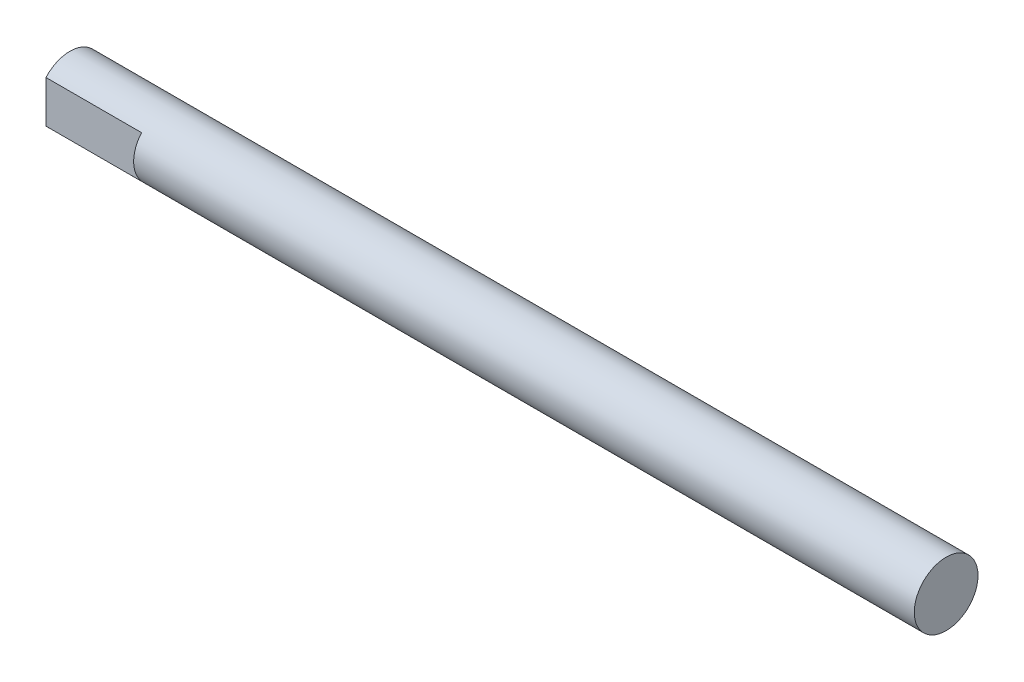
ISO-10303-21;
HEADER;
FILE_DESCRIPTION(('STEP AP214'),'2;1');
FILE_NAME('part.step','',(''),(''),'','','');
FILE_SCHEMA(('AUTOMOTIVE_DESIGN { 1 0 10303 214 1 1 1 1 }'));
ENDSEC;
DATA;
#1=APPLICATION_CONTEXT('core data for automotive mechanical design processes');
#2=APPLICATION_PROTOCOL_DEFINITION('international standard','automotive_design',2000,#1);
#3=PRODUCT_CONTEXT('',#1,'mechanical');
#4=PRODUCT('Part','Part','',(#3));
#5=PRODUCT_RELATED_PRODUCT_CATEGORY('part','',(#4));
#6=PRODUCT_DEFINITION_FORMATION('','',#4);
#7=PRODUCT_DEFINITION_CONTEXT('part definition',#1,'design');
#8=PRODUCT_DEFINITION('design','',#6,#7);
#9=PRODUCT_DEFINITION_SHAPE('','',#8);
#10=(LENGTH_UNIT() NAMED_UNIT(*) SI_UNIT(.MILLI.,.METRE.));
#11=(NAMED_UNIT(*) PLANE_ANGLE_UNIT() SI_UNIT($,.RADIAN.));
#12=(NAMED_UNIT(*) SI_UNIT($,.STERADIAN.) SOLID_ANGLE_UNIT());
#13=UNCERTAINTY_MEASURE_WITH_UNIT(LENGTH_MEASURE(1.E-05),#10,'distance_accuracy_value','');
#14=(GEOMETRIC_REPRESENTATION_CONTEXT(3) GLOBAL_UNCERTAINTY_ASSIGNED_CONTEXT((#13)) GLOBAL_UNIT_ASSIGNED_CONTEXT((#10,
#11,#12)) REPRESENTATION_CONTEXT('',''));
#15=CARTESIAN_POINT('',(0.,0.,0.));
#16=DIRECTION('',(0.,0.,1.));
#17=DIRECTION('',(1.,0.,0.));
#18=AXIS2_PLACEMENT_3D('',#15,#16,#17);
#19=CARTESIAN_POINT('',(0.,0.,0.));
#20=DIRECTION('',(1.,0.,0.));
#21=DIRECTION('',(0.,0.,-1.));
#22=AXIS2_PLACEMENT_3D('',#19,#20,#21);
#23=PLANE('',#22);
#24=DIRECTION('',(0.,-1.,0.));
#25=VECTOR('',#24,1.);
#26=CARTESIAN_POINT('',(0.,1.3228756555323,1.5));
#27=LINE('',#26,#25);
#28=CARTESIAN_POINT('',(0.,1.3228756555323,1.5));
#29=VERTEX_POINT('',#28);
#30=CARTESIAN_POINT('',(0.,-1.3228756555323,1.5));
#31=VERTEX_POINT('',#30);
#32=EDGE_CURVE('E75',#29,#31,#27,.T.);
#33=ORIENTED_EDGE('',*,*,#32,.F.);
#34=CARTESIAN_POINT('',(0.,0.,0.));
#35=DIRECTION('',(1.,0.,0.));
#36=DIRECTION('',(0.,0.,-1.));
#37=AXIS2_PLACEMENT_3D('',#34,#35,#36);
#38=CIRCLE('',#37,2.);
#39=EDGE_CURVE('E50',#31,#29,#38,.T.);
#40=ORIENTED_EDGE('',*,*,#39,.F.);
#41=EDGE_LOOP('',(#33,#40));
#42=FACE_BOUND('',#41,.T.);
#43=ADVANCED_FACE('F43',(#42),#23,.F.);
#44=CARTESIAN_POINT('',(55.,0.,0.));
#45=DIRECTION('',(-1.,0.,0.));
#46=DIRECTION('',(0.,0.,1.));
#47=AXIS2_PLACEMENT_3D('',#44,#45,#46);
#48=CYLINDRICAL_SURFACE('',#47,2.);
#49=CARTESIAN_POINT('',(6.,0.,0.));
#50=DIRECTION('',(-1.,0.,0.));
#51=DIRECTION('',(0.,0.,1.));
#52=AXIS2_PLACEMENT_3D('',#49,#50,#51);
#53=CIRCLE('',#52,2.);
#54=CARTESIAN_POINT('',(6.,-1.3228756555323,1.5));
#55=VERTEX_POINT('',#54);
#56=CARTESIAN_POINT('',(6.,1.3228756555323,1.5));
#57=VERTEX_POINT('',#56);
#58=EDGE_CURVE('E61',#55,#57,#53,.T.);
#59=ORIENTED_EDGE('',*,*,#58,.F.);
#60=DIRECTION('',(-1.,0.,0.));
#61=VECTOR('',#60,1.);
#62=CARTESIAN_POINT('',(6.,-1.3228756555323,1.5));
#63=LINE('',#62,#61);
#64=EDGE_CURVE('E79',#55,#31,#63,.T.);
#65=ORIENTED_EDGE('',*,*,#64,.T.);
#66=ORIENTED_EDGE('',*,*,#39,.T.);
#67=DIRECTION('',(-1.,0.,0.));
#68=VECTOR('',#67,1.);
#69=CARTESIAN_POINT('',(6.,1.3228756555323,1.5));
#70=LINE('',#69,#68);
#71=EDGE_CURVE('E68',#57,#29,#70,.T.);
#72=ORIENTED_EDGE('',*,*,#71,.F.);
#73=EDGE_LOOP('',(#59,#65,#66,#72));
#74=FACE_BOUND('',#73,.T.);
#75=CARTESIAN_POINT('',(55.,0.,0.));
#76=DIRECTION('',(1.,0.,0.));
#77=DIRECTION('',(0.,0.,-1.));
#78=AXIS2_PLACEMENT_3D('',#75,#76,#77);
#79=CIRCLE('',#78,2.);
#80=CARTESIAN_POINT('',(55.,0.,-2.));
#81=VERTEX_POINT('',#80);
#82=EDGE_CURVE('E11',#81,#81,#79,.T.);
#83=ORIENTED_EDGE('',*,*,#82,.F.);
#84=EDGE_LOOP('',(#83));
#85=FACE_BOUND('',#84,.T.);
#86=ADVANCED_FACE('F44',(#74,#85),#48,.T.);
#87=CARTESIAN_POINT('',(55.,0.,0.));
#88=DIRECTION('',(1.,0.,0.));
#89=DIRECTION('',(0.,0.,-1.));
#90=AXIS2_PLACEMENT_3D('',#87,#88,#89);
#91=PLANE('',#90);
#92=ORIENTED_EDGE('',*,*,#82,.T.);
#93=EDGE_LOOP('',(#92));
#94=FACE_BOUND('',#93,.T.);
#95=ADVANCED_FACE('F88',(#94),#91,.T.);
#96=CARTESIAN_POINT('',(6.,1.3228756555323,1.5));
#97=DIRECTION('',(0.,0.,-1.));
#98=DIRECTION('',(-1.,0.,0.));
#99=AXIS2_PLACEMENT_3D('',#96,#97,#98);
#100=PLANE('',#99);
#101=ORIENTED_EDGE('',*,*,#32,.T.);
#102=ORIENTED_EDGE('',*,*,#64,.F.);
#103=DIRECTION('',(0.,-1.,0.));
#104=VECTOR('',#103,1.);
#105=CARTESIAN_POINT('',(6.,1.3228756555323,1.5));
#106=LINE('',#105,#104);
#107=EDGE_CURVE('E60',#57,#55,#106,.T.);
#108=ORIENTED_EDGE('',*,*,#107,.F.);
#109=ORIENTED_EDGE('',*,*,#71,.T.);
#110=EDGE_LOOP('',(#101,#102,#108,#109));
#111=FACE_BOUND('',#110,.T.);
#112=ADVANCED_FACE('F72',(#111),#100,.F.);
#113=CARTESIAN_POINT('',(6.,0.,0.));
#114=DIRECTION('',(-1.,0.,0.));
#115=DIRECTION('',(0.,0.,1.));
#116=AXIS2_PLACEMENT_3D('',#113,#114,#115);
#117=PLANE('',#116);
#118=ORIENTED_EDGE('',*,*,#58,.T.);
#119=ORIENTED_EDGE('',*,*,#107,.T.);
#120=EDGE_LOOP('',(#118,#119));
#121=FACE_BOUND('',#120,.T.);
#122=ADVANCED_FACE('F92',(#121),#117,.T.);
#123=CLOSED_SHELL('',(#43,#86,#95,#112,#122));
#124=MANIFOLD_SOLID_BREP('B2',#123);
#125=ADVANCED_BREP_SHAPE_REPRESENTATION('',(#18,#124),#14);
#126=SHAPE_DEFINITION_REPRESENTATION(#9,#125);
ENDSEC;
END-ISO-10303-21;
